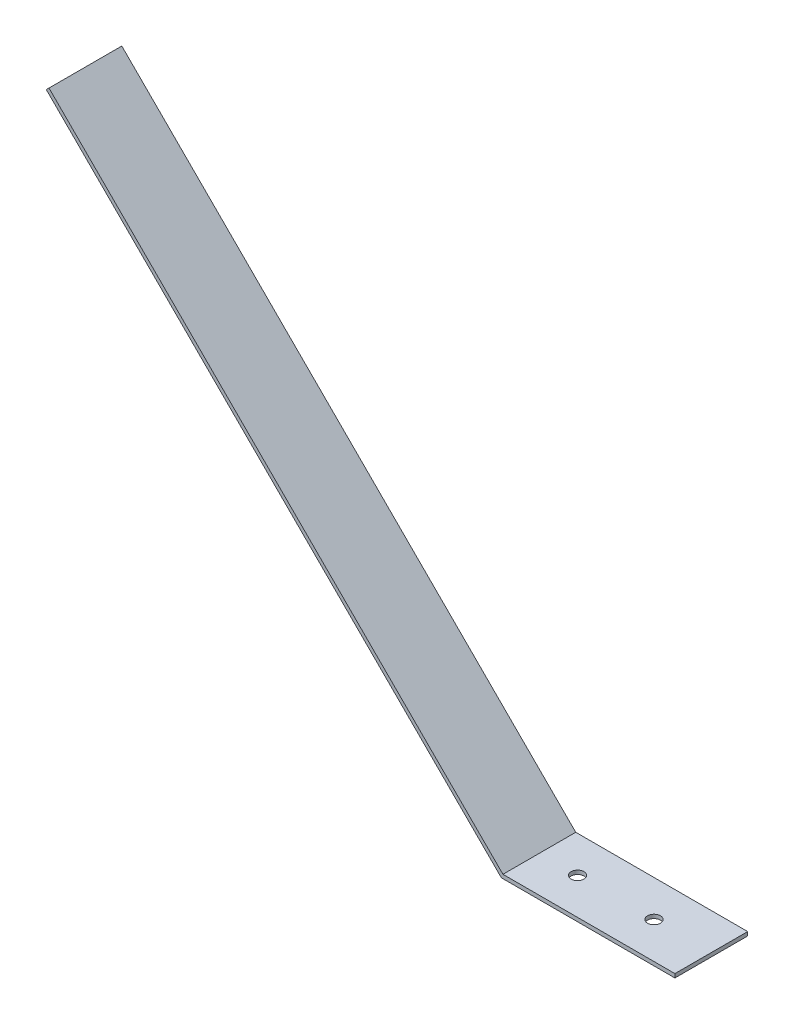
ISO-10303-21;
HEADER;
FILE_DESCRIPTION(('STEP AP214'),'2;1');
FILE_NAME('part.step','',(''),(''),'','','');
FILE_SCHEMA(('AUTOMOTIVE_DESIGN { 1 0 10303 214 1 1 1 1 }'));
ENDSEC;
DATA;
#1=APPLICATION_CONTEXT('core data for automotive mechanical design processes');
#2=APPLICATION_PROTOCOL_DEFINITION('international standard','automotive_design',2000,#1);
#3=PRODUCT_CONTEXT('',#1,'mechanical');
#4=PRODUCT('Part','Part','',(#3));
#5=PRODUCT_RELATED_PRODUCT_CATEGORY('part','',(#4));
#6=PRODUCT_DEFINITION_FORMATION('','',#4);
#7=PRODUCT_DEFINITION_CONTEXT('part definition',#1,'design');
#8=PRODUCT_DEFINITION('design','',#6,#7);
#9=PRODUCT_DEFINITION_SHAPE('','',#8);
#10=(LENGTH_UNIT() NAMED_UNIT(*) SI_UNIT(.MILLI.,.METRE.));
#11=(NAMED_UNIT(*) PLANE_ANGLE_UNIT() SI_UNIT($,.RADIAN.));
#12=(NAMED_UNIT(*) SI_UNIT($,.STERADIAN.) SOLID_ANGLE_UNIT());
#13=UNCERTAINTY_MEASURE_WITH_UNIT(LENGTH_MEASURE(1.E-05),#10,'distance_accuracy_value','');
#14=(GEOMETRIC_REPRESENTATION_CONTEXT(3) GLOBAL_UNCERTAINTY_ASSIGNED_CONTEXT((#13)) GLOBAL_UNIT_ASSIGNED_CONTEXT((#10,
#11,#12)) REPRESENTATION_CONTEXT('',''));
#15=CARTESIAN_POINT('',(0.,0.,0.));
#16=DIRECTION('',(0.,0.,1.));
#17=DIRECTION('',(1.,0.,0.));
#18=AXIS2_PLACEMENT_3D('',#15,#16,#17);
#19=CARTESIAN_POINT('',(0.,-2.,19.05));
#20=DIRECTION('',(-1.,0.,0.));
#21=DIRECTION('',(0.,0.,1.));
#22=AXIS2_PLACEMENT_3D('',#19,#20,#21);
#23=PLANE('',#22);
#24=DIRECTION('',(0.,1.,0.));
#25=VECTOR('',#24,1.);
#26=CARTESIAN_POINT('',(0.,-2.,-19.05));
#27=LINE('',#26,#25);
#28=CARTESIAN_POINT('',(0.,-2.,-19.05));
#29=VERTEX_POINT('',#28);
#30=CARTESIAN_POINT('',(0.,0.,-19.05));
#31=VERTEX_POINT('',#30);
#32=EDGE_CURVE('E117',#29,#31,#27,.T.);
#33=ORIENTED_EDGE('',*,*,#32,.T.);
#34=DIRECTION('',(0.,0.,-1.));
#35=VECTOR('',#34,1.);
#36=CARTESIAN_POINT('',(0.,0.,19.05));
#37=LINE('',#36,#35);
#38=CARTESIAN_POINT('',(0.,0.,19.05));
#39=VERTEX_POINT('',#38);
#40=EDGE_CURVE('E11',#39,#31,#37,.T.);
#41=ORIENTED_EDGE('',*,*,#40,.F.);
#42=DIRECTION('',(0.,1.,0.));
#43=VECTOR('',#42,1.);
#44=CARTESIAN_POINT('',(0.,-2.,19.05));
#45=LINE('',#44,#43);
#46=CARTESIAN_POINT('',(0.,-2.,19.05));
#47=VERTEX_POINT('',#46);
#48=EDGE_CURVE('E128',#47,#39,#45,.T.);
#49=ORIENTED_EDGE('',*,*,#48,.F.);
#50=DIRECTION('',(0.,0.,-1.));
#51=VECTOR('',#50,1.);
#52=CARTESIAN_POINT('',(0.,-2.,19.05));
#53=LINE('',#52,#51);
#54=EDGE_CURVE('E113',#47,#29,#53,.T.);
#55=ORIENTED_EDGE('',*,*,#54,.T.);
#56=EDGE_LOOP('',(#33,#41,#49,#55));
#57=FACE_BOUND('',#56,.T.);
#58=ADVANCED_FACE('F33',(#57),#23,.F.);
#59=CARTESIAN_POINT('',(0.,0.,19.05));
#60=DIRECTION('',(0.,-1.,0.));
#61=DIRECTION('',(1.,0.,0.));
#62=AXIS2_PLACEMENT_3D('',#59,#60,#61);
#63=PLANE('',#62);
#64=CARTESIAN_POINT('',(-70.,0.,0.));
#65=DIRECTION('',(0.,1.,0.));
#66=DIRECTION('',(0.,0.,1.));
#67=AXIS2_PLACEMENT_3D('',#64,#65,#66);
#68=CIRCLE('',#67,3.37819999999998);
#69=CARTESIAN_POINT('',(-70.,0.,3.37819999999998));
#70=VERTEX_POINT('',#69);
#71=EDGE_CURVE('E227',#70,#70,#68,.T.);
#72=ORIENTED_EDGE('',*,*,#71,.F.);
#73=EDGE_LOOP('',(#72));
#74=FACE_BOUND('',#73,.T.);
#75=CARTESIAN_POINT('',(-30.,0.,0.));
#76=DIRECTION('',(0.,1.,0.));
#77=DIRECTION('',(0.,0.,1.));
#78=AXIS2_PLACEMENT_3D('',#75,#76,#77);
#79=CIRCLE('',#78,3.37819999999999);
#80=CARTESIAN_POINT('',(-30.,0.,3.37819999999999));
#81=VERTEX_POINT('',#80);
#82=EDGE_CURVE('E229',#81,#81,#79,.T.);
#83=ORIENTED_EDGE('',*,*,#82,.F.);
#84=EDGE_LOOP('',(#83));
#85=FACE_BOUND('',#84,.T.);
#86=DIRECTION('',(-1.,0.,0.));
#87=VECTOR('',#86,1.);
#88=CARTESIAN_POINT('',(0.,0.,-19.05));
#89=LINE('',#88,#87);
#90=CARTESIAN_POINT('',(-90.,0.,-19.05));
#91=VERTEX_POINT('',#90);
#92=EDGE_CURVE('E120',#31,#91,#89,.T.);
#93=ORIENTED_EDGE('',*,*,#92,.T.);
#94=DIRECTION('',(0.,0.,-1.));
#95=VECTOR('',#94,1.);
#96=CARTESIAN_POINT('',(-90.,0.,19.05));
#97=LINE('',#96,#95);
#98=CARTESIAN_POINT('',(-90.,0.,19.05));
#99=VERTEX_POINT('',#98);
#100=EDGE_CURVE('E41',#99,#91,#97,.T.);
#101=ORIENTED_EDGE('',*,*,#100,.F.);
#102=DIRECTION('',(-1.,0.,0.));
#103=VECTOR('',#102,1.);
#104=CARTESIAN_POINT('',(0.,0.,19.05));
#105=LINE('',#104,#103);
#106=EDGE_CURVE('E86',#39,#99,#105,.T.);
#107=ORIENTED_EDGE('',*,*,#106,.F.);
#108=ORIENTED_EDGE('',*,*,#40,.T.);
#109=EDGE_LOOP('',(#93,#101,#107,#108));
#110=FACE_BOUND('',#109,.T.);
#111=ADVANCED_FACE('F155',(#74,#85,#110),#63,.F.);
#112=CARTESIAN_POINT('',(-90.,0.,19.05));
#113=DIRECTION('',(-0.707106781186549,-0.707106781186546,0.));
#114=DIRECTION('',(0.707106781186546,-0.707106781186549,0.));
#115=AXIS2_PLACEMENT_3D('',#112,#113,#114);
#116=PLANE('',#115);
#117=DIRECTION('',(-0.707106781186546,0.707106781186549,0.));
#118=VECTOR('',#117,1.);
#119=CARTESIAN_POINT('',(-90.,0.,-19.05));
#120=LINE('',#119,#118);
#121=CARTESIAN_POINT('',(-327.58787847868,237.58787847868,-19.05));
#122=VERTEX_POINT('',#121);
#123=EDGE_CURVE('E123',#91,#122,#120,.T.);
#124=ORIENTED_EDGE('',*,*,#123,.T.);
#125=DIRECTION('',(0.,0.,-1.));
#126=VECTOR('',#125,1.);
#127=CARTESIAN_POINT('',(-327.58787847868,237.58787847868,19.05));
#128=LINE('',#127,#126);
#129=CARTESIAN_POINT('',(-327.58787847868,237.58787847868,19.05));
#130=VERTEX_POINT('',#129);
#131=EDGE_CURVE('E108',#130,#122,#128,.T.);
#132=ORIENTED_EDGE('',*,*,#131,.F.);
#133=DIRECTION('',(-0.707106781186546,0.707106781186549,0.));
#134=VECTOR('',#133,1.);
#135=CARTESIAN_POINT('',(-90.,0.,19.05));
#136=LINE('',#135,#134);
#137=EDGE_CURVE('E99',#99,#130,#136,.T.);
#138=ORIENTED_EDGE('',*,*,#137,.F.);
#139=ORIENTED_EDGE('',*,*,#100,.T.);
#140=EDGE_LOOP('',(#124,#132,#138,#139));
#141=FACE_BOUND('',#140,.T.);
#142=ADVANCED_FACE('F134',(#141),#116,.F.);
#143=CARTESIAN_POINT('',(-329.002092041053,236.173664916307,19.05));
#144=DIRECTION('',(0.70710678118652,-0.707106781186575,0.));
#145=DIRECTION('',(0.707106781186575,0.70710678118652,0.));
#146=AXIS2_PLACEMENT_3D('',#143,#144,#145);
#147=PLANE('',#146);
#148=DIRECTION('',(-0.707106781186575,-0.70710678118652,0.));
#149=VECTOR('',#148,1.);
#150=CARTESIAN_POINT('',(-329.002092041053,236.173664916307,-19.05));
#151=LINE('',#150,#149);
#152=CARTESIAN_POINT('',(-329.002092041053,236.173664916307,-19.05));
#153=VERTEX_POINT('',#152);
#154=EDGE_CURVE('E107',#122,#153,#151,.T.);
#155=ORIENTED_EDGE('',*,*,#154,.T.);
#156=DIRECTION('',(0.,0.,-1.));
#157=VECTOR('',#156,1.);
#158=CARTESIAN_POINT('',(-329.002092041053,236.173664916307,19.05));
#159=LINE('',#158,#157);
#160=CARTESIAN_POINT('',(-329.002092041053,236.173664916307,19.05));
#161=VERTEX_POINT('',#160);
#162=EDGE_CURVE('E104',#161,#153,#159,.T.);
#163=ORIENTED_EDGE('',*,*,#162,.F.);
#164=DIRECTION('',(-0.707106781186575,-0.70710678118652,0.));
#165=VECTOR('',#164,1.);
#166=CARTESIAN_POINT('',(-329.002092041053,236.173664916307,19.05));
#167=LINE('',#166,#165);
#168=EDGE_CURVE('E93',#130,#161,#167,.T.);
#169=ORIENTED_EDGE('',*,*,#168,.F.);
#170=ORIENTED_EDGE('',*,*,#131,.T.);
#171=EDGE_LOOP('',(#155,#163,#169,#170));
#172=FACE_BOUND('',#171,.T.);
#173=ADVANCED_FACE('F105',(#172),#147,.F.);
#174=CARTESIAN_POINT('',(-90.8284271247462,-2.00000000000001,19.05));
#175=DIRECTION('',(0.707106781186549,0.707106781186546,0.));
#176=DIRECTION('',(-0.707106781186546,0.707106781186549,0.));
#177=AXIS2_PLACEMENT_3D('',#174,#175,#176);
#178=PLANE('',#177);
#179=DIRECTION('',(0.707106781186546,-0.707106781186549,0.));
#180=VECTOR('',#179,1.);
#181=CARTESIAN_POINT('',(-90.8284271247462,-2.00000000000001,-19.05));
#182=LINE('',#181,#180);
#183=CARTESIAN_POINT('',(-90.8284271247462,-2.00000000000001,-19.05));
#184=VERTEX_POINT('',#183);
#185=EDGE_CURVE('E72',#153,#184,#182,.T.);
#186=ORIENTED_EDGE('',*,*,#185,.T.);
#187=DIRECTION('',(0.,0.,-1.));
#188=VECTOR('',#187,1.);
#189=CARTESIAN_POINT('',(-90.8284271247462,-2.00000000000001,19.05));
#190=LINE('',#189,#188);
#191=CARTESIAN_POINT('',(-90.8284271247462,-2.00000000000001,19.05));
#192=VERTEX_POINT('',#191);
#193=EDGE_CURVE('E109',#192,#184,#190,.T.);
#194=ORIENTED_EDGE('',*,*,#193,.F.);
#195=DIRECTION('',(0.707106781186546,-0.707106781186549,0.));
#196=VECTOR('',#195,1.);
#197=CARTESIAN_POINT('',(-90.8284271247462,-2.00000000000001,19.05));
#198=LINE('',#197,#196);
#199=EDGE_CURVE('E97',#161,#192,#198,.T.);
#200=ORIENTED_EDGE('',*,*,#199,.F.);
#201=ORIENTED_EDGE('',*,*,#162,.T.);
#202=EDGE_LOOP('',(#186,#194,#200,#201));
#203=FACE_BOUND('',#202,.T.);
#204=ADVANCED_FACE('F111',(#203),#178,.F.);
#205=CARTESIAN_POINT('',(0.,-2.,19.05));
#206=DIRECTION('',(0.,1.,0.));
#207=DIRECTION('',(-1.,0.,0.));
#208=AXIS2_PLACEMENT_3D('',#205,#206,#207);
#209=PLANE('',#208);
#210=CARTESIAN_POINT('',(-70.,-2.00000000000002,0.));
#211=DIRECTION('',(0.,1.,0.));
#212=DIRECTION('',(0.,0.,1.));
#213=AXIS2_PLACEMENT_3D('',#210,#211,#212);
#214=CIRCLE('',#213,3.3782);
#215=CARTESIAN_POINT('',(-70.,-2.00000000000002,3.3782));
#216=VERTEX_POINT('',#215);
#217=EDGE_CURVE('E225',#216,#216,#214,.T.);
#218=ORIENTED_EDGE('',*,*,#217,.T.);
#219=EDGE_LOOP('',(#218));
#220=FACE_BOUND('',#219,.T.);
#221=CARTESIAN_POINT('',(-30.,-2.00000000000002,0.));
#222=DIRECTION('',(0.,1.,0.));
#223=DIRECTION('',(0.,0.,1.));
#224=AXIS2_PLACEMENT_3D('',#221,#222,#223);
#225=CIRCLE('',#224,3.3782);
#226=CARTESIAN_POINT('',(-30.,-2.00000000000002,3.3782));
#227=VERTEX_POINT('',#226);
#228=EDGE_CURVE('E121',#227,#227,#225,.T.);
#229=ORIENTED_EDGE('',*,*,#228,.T.);
#230=EDGE_LOOP('',(#229));
#231=FACE_BOUND('',#230,.T.);
#232=DIRECTION('',(1.,0.,0.));
#233=VECTOR('',#232,1.);
#234=CARTESIAN_POINT('',(0.,-2.,-19.05));
#235=LINE('',#234,#233);
#236=EDGE_CURVE('E78',#184,#29,#235,.T.);
#237=ORIENTED_EDGE('',*,*,#236,.T.);
#238=ORIENTED_EDGE('',*,*,#54,.F.);
#239=DIRECTION('',(1.,0.,0.));
#240=VECTOR('',#239,1.);
#241=CARTESIAN_POINT('',(0.,-2.,19.05));
#242=LINE('',#241,#240);
#243=EDGE_CURVE('E49',#192,#47,#242,.T.);
#244=ORIENTED_EDGE('',*,*,#243,.F.);
#245=ORIENTED_EDGE('',*,*,#193,.T.);
#246=EDGE_LOOP('',(#237,#238,#244,#245));
#247=FACE_BOUND('',#246,.T.);
#248=ADVANCED_FACE('F141',(#220,#231,#247),#209,.F.);
#249=CARTESIAN_POINT('',(0.,0.,19.05));
#250=DIRECTION('',(0.,0.,1.));
#251=DIRECTION('',(1.,0.,0.));
#252=AXIS2_PLACEMENT_3D('',#249,#250,#251);
#253=PLANE('',#252);
#254=ORIENTED_EDGE('',*,*,#48,.T.);
#255=ORIENTED_EDGE('',*,*,#106,.T.);
#256=ORIENTED_EDGE('',*,*,#137,.T.);
#257=ORIENTED_EDGE('',*,*,#168,.T.);
#258=ORIENTED_EDGE('',*,*,#199,.T.);
#259=ORIENTED_EDGE('',*,*,#243,.T.);
#260=EDGE_LOOP('',(#254,#255,#256,#257,#258,#259));
#261=FACE_BOUND('',#260,.T.);
#262=ADVANCED_FACE('F95',(#261),#253,.T.);
#263=CARTESIAN_POINT('',(0.,0.,-19.05));
#264=DIRECTION('',(0.,0.,1.));
#265=DIRECTION('',(1.,0.,0.));
#266=AXIS2_PLACEMENT_3D('',#263,#264,#265);
#267=PLANE('',#266);
#268=ORIENTED_EDGE('',*,*,#32,.F.);
#269=ORIENTED_EDGE('',*,*,#236,.F.);
#270=ORIENTED_EDGE('',*,*,#185,.F.);
#271=ORIENTED_EDGE('',*,*,#154,.F.);
#272=ORIENTED_EDGE('',*,*,#123,.F.);
#273=ORIENTED_EDGE('',*,*,#92,.F.);
#274=EDGE_LOOP('',(#268,#269,#270,#271,#272,#273));
#275=FACE_BOUND('',#274,.T.);
#276=ADVANCED_FACE('F137',(#275),#267,.F.);
#277=CARTESIAN_POINT('',(-30.,0.,0.));
#278=DIRECTION('',(0.,1.,0.));
#279=DIRECTION('',(0.,0.,1.));
#280=AXIS2_PLACEMENT_3D('',#277,#278,#279);
#281=CYLINDRICAL_SURFACE('',#280,3.37819999999999);
#282=ORIENTED_EDGE('',*,*,#228,.F.);
#283=EDGE_LOOP('',(#282));
#284=FACE_BOUND('',#283,.T.);
#285=ORIENTED_EDGE('',*,*,#82,.T.);
#286=EDGE_LOOP('',(#285));
#287=FACE_BOUND('',#286,.T.);
#288=ADVANCED_FACE('F191',(#284,#287),#281,.F.);
#289=CARTESIAN_POINT('',(-70.,0.,0.));
#290=DIRECTION('',(0.,1.,0.));
#291=DIRECTION('',(0.,0.,1.));
#292=AXIS2_PLACEMENT_3D('',#289,#290,#291);
#293=CYLINDRICAL_SURFACE('',#292,3.37819999999999);
#294=ORIENTED_EDGE('',*,*,#217,.F.);
#295=EDGE_LOOP('',(#294));
#296=FACE_BOUND('',#295,.T.);
#297=ORIENTED_EDGE('',*,*,#71,.T.);
#298=EDGE_LOOP('',(#297));
#299=FACE_BOUND('',#298,.T.);
#300=ADVANCED_FACE('F209',(#296,#299),#293,.F.);
#301=CLOSED_SHELL('',(#58,#111,#142,#173,#204,#248,#262,#276,#288,#300));
#302=MANIFOLD_SOLID_BREP('B2',#301);
#303=ADVANCED_BREP_SHAPE_REPRESENTATION('',(#18,#302),#14);
#304=SHAPE_DEFINITION_REPRESENTATION(#9,#303);
ENDSEC;
END-ISO-10303-21;
